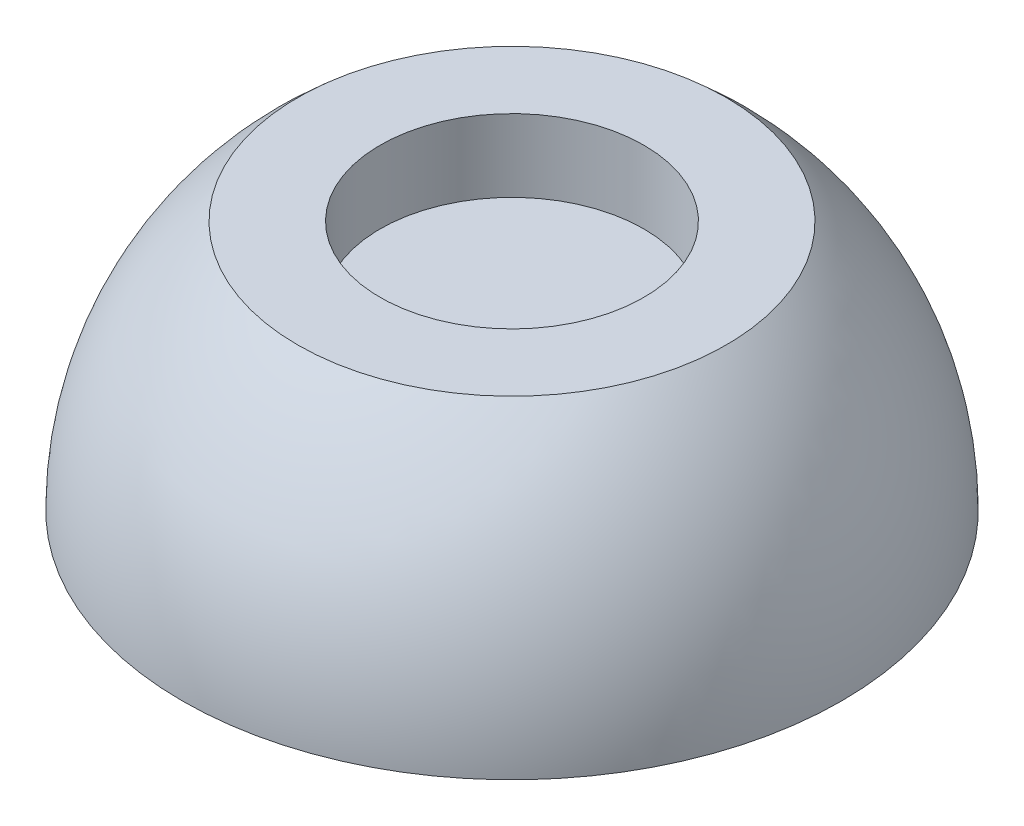
ISO-10303-21;
HEADER;
FILE_DESCRIPTION(('STEP AP214'),'2;1');
FILE_NAME('part.step','',(''),(''),'','','');
FILE_SCHEMA(('AUTOMOTIVE_DESIGN { 1 0 10303 214 1 1 1 1 }'));
ENDSEC;
DATA;
#1=APPLICATION_CONTEXT('core data for automotive mechanical design processes');
#2=APPLICATION_PROTOCOL_DEFINITION('international standard','automotive_design',2000,#1);
#3=PRODUCT_CONTEXT('',#1,'mechanical');
#4=PRODUCT('Part','Part','',(#3));
#5=PRODUCT_RELATED_PRODUCT_CATEGORY('part','',(#4));
#6=PRODUCT_DEFINITION_FORMATION('','',#4);
#7=PRODUCT_DEFINITION_CONTEXT('part definition',#1,'design');
#8=PRODUCT_DEFINITION('design','',#6,#7);
#9=PRODUCT_DEFINITION_SHAPE('','',#8);
#10=(LENGTH_UNIT() NAMED_UNIT(*) SI_UNIT(.MILLI.,.METRE.));
#11=(NAMED_UNIT(*) PLANE_ANGLE_UNIT() SI_UNIT($,.RADIAN.));
#12=(NAMED_UNIT(*) SI_UNIT($,.STERADIAN.) SOLID_ANGLE_UNIT());
#13=UNCERTAINTY_MEASURE_WITH_UNIT(LENGTH_MEASURE(1.E-05),#10,'distance_accuracy_value','');
#14=(GEOMETRIC_REPRESENTATION_CONTEXT(3) GLOBAL_UNCERTAINTY_ASSIGNED_CONTEXT((#13)) GLOBAL_UNIT_ASSIGNED_CONTEXT((#10,
#11,#12)) REPRESENTATION_CONTEXT('',''));
#15=CARTESIAN_POINT('',(0.,0.,0.));
#16=DIRECTION('',(0.,0.,1.));
#17=DIRECTION('',(1.,0.,0.));
#18=AXIS2_PLACEMENT_3D('',#15,#16,#17);
#19=CARTESIAN_POINT('',(12.5,0.,0.));
#20=DIRECTION('',(0.,-1.,0.));
#21=DIRECTION('',(0.,0.,-1.));
#22=AXIS2_PLACEMENT_3D('',#19,#20,#21);
#23=PLANE('',#22);
#24=CARTESIAN_POINT('',(0.,0.,0.));
#25=DIRECTION('',(0.,-1.,0.));
#26=DIRECTION('',(0.,0.,-1.));
#27=AXIS2_PLACEMENT_3D('',#24,#25,#26);
#28=CIRCLE('',#27,12.5);
#29=CARTESIAN_POINT('',(0.,0.,-12.5));
#30=VERTEX_POINT('',#29);
#31=EDGE_CURVE('E218',#30,#30,#28,.T.);
#32=ORIENTED_EDGE('',*,*,#31,.T.);
#33=EDGE_LOOP('',(#32));
#34=FACE_BOUND('',#33,.T.);
#35=DIRECTION('',(-0.422618261740697,0.,-0.906307787036651));
#36=VECTOR('',#35,1.);
#37=CARTESIAN_POINT('',(0.,0.,-9.));
#38=LINE('',#37,#36);
#39=CARTESIAN_POINT('',(2.55617271844715,0.,-3.51826991527231));
#40=VERTEX_POINT('',#39);
#41=CARTESIAN_POINT('',(0.,0.,-9.));
#42=VERTEX_POINT('',#41);
#43=EDGE_CURVE('E189',#40,#42,#38,.T.);
#44=ORIENTED_EDGE('',*,*,#43,.T.);
#45=DIRECTION('',(-0.422618261740697,0.,0.906307787036651));
#46=VECTOR('',#45,1.);
#47=CARTESIAN_POINT('',(-2.55617271844715,0.,-3.51826991527231));
#48=LINE('',#47,#46);
#49=CARTESIAN_POINT('',(-2.55617271844715,0.,-3.51826991527231));
#50=VERTEX_POINT('',#49);
#51=EDGE_CURVE('E59',#42,#50,#48,.T.);
#52=ORIENTED_EDGE('',*,*,#51,.T.);
#53=DIRECTION('',(-0.992546151641322,0.,0.121869343405145));
#54=VECTOR('',#53,1.);
#55=CARTESIAN_POINT('',(-8.55950864665638,0.,-2.78115294937452));
#56=LINE('',#55,#54);
#57=CARTESIAN_POINT('',(-8.55950864665638,0.,-2.78115294937452));
#58=VERTEX_POINT('',#57);
#59=EDGE_CURVE('E160',#50,#58,#56,.T.);
#60=ORIENTED_EDGE('',*,*,#59,.T.);
#61=DIRECTION('',(0.731353701619173,0.,0.681998360062496));
#62=VECTOR('',#61,1.);
#63=CARTESIAN_POINT('',(-4.13597433956271,0.,1.34385952603781));
#64=LINE('',#63,#62);
#65=CARTESIAN_POINT('',(-4.13597433956271,0.,1.34385952603781));
#66=VERTEX_POINT('',#65);
#67=EDGE_CURVE('E164',#58,#66,#64,.T.);
#68=ORIENTED_EDGE('',*,*,#67,.T.);
#69=DIRECTION('',(-0.190808995376547,0.,0.981627183447664));
#70=VECTOR('',#69,1.);
#71=CARTESIAN_POINT('',(-5.29006727063225,0.,7.28115294937453));
#72=LINE('',#71,#70);
#73=CARTESIAN_POINT('',(-5.29006727063225,0.,7.28115294937453));
#74=VERTEX_POINT('',#73);
#75=EDGE_CURVE('E168',#66,#74,#72,.T.);
#76=ORIENTED_EDGE('',*,*,#75,.T.);
#77=DIRECTION('',(0.874619707139394,0.,-0.48480962024634));
#78=VECTOR('',#77,1.);
#79=CARTESIAN_POINT('',(0.,0.,4.348820778469));
#80=LINE('',#79,#78);
#81=CARTESIAN_POINT('',(0.,0.,4.348820778469));
#82=VERTEX_POINT('',#81);
#83=EDGE_CURVE('E172',#74,#82,#80,.T.);
#84=ORIENTED_EDGE('',*,*,#83,.T.);
#85=DIRECTION('',(0.874619707139394,0.,0.48480962024634));
#86=VECTOR('',#85,1.);
#87=CARTESIAN_POINT('',(5.29006727063226,0.,7.28115294937453));
#88=LINE('',#87,#86);
#89=CARTESIAN_POINT('',(5.29006727063226,0.,7.28115294937453));
#90=VERTEX_POINT('',#89);
#91=EDGE_CURVE('E176',#82,#90,#88,.T.);
#92=ORIENTED_EDGE('',*,*,#91,.T.);
#93=DIRECTION('',(-0.190808995376547,0.,-0.981627183447664));
#94=VECTOR('',#93,1.);
#95=CARTESIAN_POINT('',(4.13597433956271,0.,1.34385952603781));
#96=LINE('',#95,#94);
#97=CARTESIAN_POINT('',(4.13597433956271,0.,1.34385952603781));
#98=VERTEX_POINT('',#97);
#99=EDGE_CURVE('E180',#90,#98,#96,.T.);
#100=ORIENTED_EDGE('',*,*,#99,.T.);
#101=DIRECTION('',(0.731353701619172,0.,-0.681998360062497));
#102=VECTOR('',#101,1.);
#103=CARTESIAN_POINT('',(8.55950864665638,0.,-2.78115294937453));
#104=LINE('',#103,#102);
#105=CARTESIAN_POINT('',(8.55950864665638,0.,-2.78115294937453));
#106=VERTEX_POINT('',#105);
#107=EDGE_CURVE('E184',#98,#106,#104,.T.);
#108=ORIENTED_EDGE('',*,*,#107,.T.);
#109=DIRECTION('',(-0.992546151641322,0.,-0.121869343405145));
#110=VECTOR('',#109,1.);
#111=CARTESIAN_POINT('',(2.55617271844715,0.,-3.51826991527231));
#112=LINE('',#111,#110);
#113=EDGE_CURVE('E146',#106,#40,#112,.T.);
#114=ORIENTED_EDGE('',*,*,#113,.T.);
#115=EDGE_LOOP('',(#44,#52,#60,#68,#76,#84,#92,#100,#108,#114));
#116=FACE_BOUND('',#115,.T.);
#117=ADVANCED_FACE('F43',(#34,#116),#23,.T.);
#118=CARTESIAN_POINT('',(0.,0.,0.));
#119=DIRECTION('',(0.,-1.,0.));
#120=DIRECTION('',(1.,0.,0.));
#121=AXIS2_PLACEMENT_3D('',#118,#119,#120);
#122=SPHERICAL_SURFACE('',#121,12.5);
#123=CARTESIAN_POINT('',(0.,9.5,0.));
#124=DIRECTION('',(0.,-1.,0.));
#125=DIRECTION('',(0.,0.,-1.));
#126=AXIS2_PLACEMENT_3D('',#123,#124,#125);
#127=CIRCLE('',#126,8.12403840463596);
#128=CARTESIAN_POINT('',(0.,9.5,-8.12403840463596));
#129=VERTEX_POINT('',#128);
#130=EDGE_CURVE('E11',#129,#129,#127,.T.);
#131=ORIENTED_EDGE('',*,*,#130,.T.);
#132=EDGE_LOOP('',(#131));
#133=FACE_BOUND('',#132,.T.);
#134=ORIENTED_EDGE('',*,*,#31,.F.);
#135=EDGE_LOOP('',(#134));
#136=FACE_BOUND('',#135,.T.);
#137=ADVANCED_FACE('F45',(#133,#136),#122,.T.);
#138=CARTESIAN_POINT('',(5.,9.5,0.));
#139=DIRECTION('',(0.,1.,0.));
#140=DIRECTION('',(0.,0.,1.));
#141=AXIS2_PLACEMENT_3D('',#138,#139,#140);
#142=PLANE('',#141);
#143=CARTESIAN_POINT('',(0.,9.5,0.));
#144=DIRECTION('',(0.,-1.,0.));
#145=DIRECTION('',(0.,0.,-1.));
#146=AXIS2_PLACEMENT_3D('',#143,#144,#145);
#147=CIRCLE('',#146,5.);
#148=CARTESIAN_POINT('',(0.,9.5,-5.));
#149=VERTEX_POINT('',#148);
#150=EDGE_CURVE('E52',#149,#149,#147,.T.);
#151=ORIENTED_EDGE('',*,*,#150,.T.);
#152=EDGE_LOOP('',(#151));
#153=FACE_BOUND('',#152,.T.);
#154=ORIENTED_EDGE('',*,*,#130,.F.);
#155=EDGE_LOOP('',(#154));
#156=FACE_BOUND('',#155,.T.);
#157=ADVANCED_FACE('F229',(#153,#156),#142,.T.);
#158=CARTESIAN_POINT('',(0.,0.,0.));
#159=DIRECTION('',(0.,-1.,0.));
#160=DIRECTION('',(0.,0.,-1.));
#161=AXIS2_PLACEMENT_3D('',#158,#159,#160);
#162=CYLINDRICAL_SURFACE('',#161,5.);
#163=CARTESIAN_POINT('',(0.,6.75,0.));
#164=DIRECTION('',(0.,-1.,0.));
#165=DIRECTION('',(0.,0.,-1.));
#166=AXIS2_PLACEMENT_3D('',#163,#164,#165);
#167=CIRCLE('',#166,5.);
#168=CARTESIAN_POINT('',(0.,6.75,-5.));
#169=VERTEX_POINT('',#168);
#170=EDGE_CURVE('E222',#169,#169,#167,.T.);
#171=ORIENTED_EDGE('',*,*,#170,.T.);
#172=EDGE_LOOP('',(#171));
#173=FACE_BOUND('',#172,.T.);
#174=ORIENTED_EDGE('',*,*,#150,.F.);
#175=EDGE_LOOP('',(#174));
#176=FACE_BOUND('',#175,.T.);
#177=ADVANCED_FACE('F232',(#173,#176),#162,.F.);
#178=CARTESIAN_POINT('',(0.,6.75,0.));
#179=DIRECTION('',(0.,1.,0.));
#180=DIRECTION('',(0.,0.,1.));
#181=AXIS2_PLACEMENT_3D('',#178,#179,#180);
#182=PLANE('',#181);
#183=ORIENTED_EDGE('',*,*,#170,.F.);
#184=EDGE_LOOP('',(#183));
#185=FACE_BOUND('',#184,.T.);
#186=ADVANCED_FACE('F234',(#185),#182,.T.);
#187=CARTESIAN_POINT('',(-2.55617271844715,5.,-3.51826991527231));
#188=DIRECTION('',(0.906307787036651,0.,0.422618261740697));
#189=DIRECTION('',(0.422618261740697,0.,-0.906307787036651));
#190=AXIS2_PLACEMENT_3D('',#187,#188,#189);
#191=PLANE('',#190);
#192=ORIENTED_EDGE('',*,*,#51,.F.);
#193=DIRECTION('',(0.,-1.,0.));
#194=VECTOR('',#193,1.);
#195=CARTESIAN_POINT('',(0.,5.,-9.));
#196=LINE('',#195,#194);
#197=CARTESIAN_POINT('',(0.,5.,-9.));
#198=VERTEX_POINT('',#197);
#199=EDGE_CURVE('E154',#198,#42,#196,.T.);
#200=ORIENTED_EDGE('',*,*,#199,.F.);
#201=DIRECTION('',(-0.422618261740697,0.,0.906307787036651));
#202=VECTOR('',#201,1.);
#203=CARTESIAN_POINT('',(-2.55617271844715,5.,-3.51826991527231));
#204=LINE('',#203,#202);
#205=CARTESIAN_POINT('',(-2.55617271844715,5.,-3.51826991527231));
#206=VERTEX_POINT('',#205);
#207=EDGE_CURVE('E193',#198,#206,#204,.T.);
#208=ORIENTED_EDGE('',*,*,#207,.T.);
#209=DIRECTION('',(0.,-1.,0.));
#210=VECTOR('',#209,1.);
#211=CARTESIAN_POINT('',(-2.55617271844715,5.,-3.51826991527231));
#212=LINE('',#211,#210);
#213=EDGE_CURVE('E215',#206,#50,#212,.T.);
#214=ORIENTED_EDGE('',*,*,#213,.T.);
#215=EDGE_LOOP('',(#192,#200,#208,#214));
#216=FACE_BOUND('',#215,.T.);
#217=ADVANCED_FACE('F241',(#216),#191,.T.);
#218=CARTESIAN_POINT('',(-8.55950864665638,5.,-2.78115294937452));
#219=DIRECTION('',(0.121869343405145,0.,0.992546151641322));
#220=DIRECTION('',(0.992546151641322,0.,-0.121869343405145));
#221=AXIS2_PLACEMENT_3D('',#218,#219,#220);
#222=PLANE('',#221);
#223=ORIENTED_EDGE('',*,*,#59,.F.);
#224=ORIENTED_EDGE('',*,*,#213,.F.);
#225=DIRECTION('',(-0.992546151641322,0.,0.121869343405145));
#226=VECTOR('',#225,1.);
#227=CARTESIAN_POINT('',(-8.55950864665638,5.,-2.78115294937452));
#228=LINE('',#227,#226);
#229=CARTESIAN_POINT('',(-8.55950864665638,5.,-2.78115294937452));
#230=VERTEX_POINT('',#229);
#231=EDGE_CURVE('E110',#206,#230,#228,.T.);
#232=ORIENTED_EDGE('',*,*,#231,.T.);
#233=DIRECTION('',(0.,-1.,0.));
#234=VECTOR('',#233,1.);
#235=CARTESIAN_POINT('',(-8.55950864665638,5.,-2.78115294937452));
#236=LINE('',#235,#234);
#237=EDGE_CURVE('E212',#230,#58,#236,.T.);
#238=ORIENTED_EDGE('',*,*,#237,.T.);
#239=EDGE_LOOP('',(#223,#224,#232,#238));
#240=FACE_BOUND('',#239,.T.);
#241=ADVANCED_FACE('F255',(#240),#222,.T.);
#242=CARTESIAN_POINT('',(-4.13597433956271,5.,1.34385952603781));
#243=DIRECTION('',(0.681998360062496,0.,-0.731353701619173));
#244=DIRECTION('',(-0.731353701619173,0.,-0.681998360062496));
#245=AXIS2_PLACEMENT_3D('',#242,#243,#244);
#246=PLANE('',#245);
#247=ORIENTED_EDGE('',*,*,#67,.F.);
#248=ORIENTED_EDGE('',*,*,#237,.F.);
#249=DIRECTION('',(0.731353701619173,0.,0.681998360062496));
#250=VECTOR('',#249,1.);
#251=CARTESIAN_POINT('',(-4.13597433956271,5.,1.34385952603781));
#252=LINE('',#251,#250);
#253=CARTESIAN_POINT('',(-4.13597433956271,5.,1.34385952603781));
#254=VERTEX_POINT('',#253);
#255=EDGE_CURVE('E426',#230,#254,#252,.T.);
#256=ORIENTED_EDGE('',*,*,#255,.T.);
#257=DIRECTION('',(0.,-1.,0.));
#258=VECTOR('',#257,1.);
#259=CARTESIAN_POINT('',(-4.13597433956271,5.,1.34385952603781));
#260=LINE('',#259,#258);
#261=EDGE_CURVE('E209',#254,#66,#260,.T.);
#262=ORIENTED_EDGE('',*,*,#261,.T.);
#263=EDGE_LOOP('',(#247,#248,#256,#262));
#264=FACE_BOUND('',#263,.T.);
#265=ADVANCED_FACE('F258',(#264),#246,.T.);
#266=CARTESIAN_POINT('',(-5.29006727063225,5.,7.28115294937453));
#267=DIRECTION('',(0.981627183447664,0.,0.190808995376547));
#268=DIRECTION('',(0.190808995376547,0.,-0.981627183447664));
#269=AXIS2_PLACEMENT_3D('',#266,#267,#268);
#270=PLANE('',#269);
#271=ORIENTED_EDGE('',*,*,#75,.F.);
#272=ORIENTED_EDGE('',*,*,#261,.F.);
#273=DIRECTION('',(-0.190808995376547,0.,0.981627183447664));
#274=VECTOR('',#273,1.);
#275=CARTESIAN_POINT('',(-5.29006727063225,5.,7.28115294937453));
#276=LINE('',#275,#274);
#277=CARTESIAN_POINT('',(-5.29006727063225,5.,7.28115294937453));
#278=VERTEX_POINT('',#277);
#279=EDGE_CURVE('E423',#254,#278,#276,.T.);
#280=ORIENTED_EDGE('',*,*,#279,.T.);
#281=DIRECTION('',(0.,-1.,0.));
#282=VECTOR('',#281,1.);
#283=CARTESIAN_POINT('',(-5.29006727063225,5.,7.28115294937453));
#284=LINE('',#283,#282);
#285=EDGE_CURVE('E206',#278,#74,#284,.T.);
#286=ORIENTED_EDGE('',*,*,#285,.T.);
#287=EDGE_LOOP('',(#271,#272,#280,#286));
#288=FACE_BOUND('',#287,.T.);
#289=ADVANCED_FACE('F262',(#288),#270,.T.);
#290=CARTESIAN_POINT('',(0.,5.,4.348820778469));
#291=DIRECTION('',(-0.48480962024634,0.,-0.874619707139394));
#292=DIRECTION('',(-0.874619707139394,0.,0.48480962024634));
#293=AXIS2_PLACEMENT_3D('',#290,#291,#292);
#294=PLANE('',#293);
#295=ORIENTED_EDGE('',*,*,#83,.F.);
#296=ORIENTED_EDGE('',*,*,#285,.F.);
#297=DIRECTION('',(0.874619707139394,0.,-0.48480962024634));
#298=VECTOR('',#297,1.);
#299=CARTESIAN_POINT('',(0.,5.,4.348820778469));
#300=LINE('',#299,#298);
#301=CARTESIAN_POINT('',(0.,5.,4.348820778469));
#302=VERTEX_POINT('',#301);
#303=EDGE_CURVE('E418',#278,#302,#300,.T.);
#304=ORIENTED_EDGE('',*,*,#303,.T.);
#305=DIRECTION('',(0.,-1.,0.));
#306=VECTOR('',#305,1.);
#307=CARTESIAN_POINT('',(0.,5.,4.348820778469));
#308=LINE('',#307,#306);
#309=EDGE_CURVE('E203',#302,#82,#308,.T.);
#310=ORIENTED_EDGE('',*,*,#309,.T.);
#311=EDGE_LOOP('',(#295,#296,#304,#310));
#312=FACE_BOUND('',#311,.T.);
#313=ADVANCED_FACE('F266',(#312),#294,.T.);
#314=CARTESIAN_POINT('',(5.29006727063226,5.,7.28115294937453));
#315=DIRECTION('',(0.48480962024634,0.,-0.874619707139394));
#316=DIRECTION('',(-0.874619707139394,0.,-0.48480962024634));
#317=AXIS2_PLACEMENT_3D('',#314,#315,#316);
#318=PLANE('',#317);
#319=ORIENTED_EDGE('',*,*,#91,.F.);
#320=ORIENTED_EDGE('',*,*,#309,.F.);
#321=DIRECTION('',(0.874619707139394,0.,0.48480962024634));
#322=VECTOR('',#321,1.);
#323=CARTESIAN_POINT('',(5.29006727063226,5.,7.28115294937453));
#324=LINE('',#323,#322);
#325=CARTESIAN_POINT('',(5.29006727063226,5.,7.28115294937453));
#326=VERTEX_POINT('',#325);
#327=EDGE_CURVE('E416',#302,#326,#324,.T.);
#328=ORIENTED_EDGE('',*,*,#327,.T.);
#329=DIRECTION('',(0.,-1.,0.));
#330=VECTOR('',#329,1.);
#331=CARTESIAN_POINT('',(5.29006727063226,5.,7.28115294937453));
#332=LINE('',#331,#330);
#333=EDGE_CURVE('E200',#326,#90,#332,.T.);
#334=ORIENTED_EDGE('',*,*,#333,.T.);
#335=EDGE_LOOP('',(#319,#320,#328,#334));
#336=FACE_BOUND('',#335,.T.);
#337=ADVANCED_FACE('F270',(#336),#318,.T.);
#338=CARTESIAN_POINT('',(4.13597433956271,5.,1.34385952603781));
#339=DIRECTION('',(-0.981627183447664,0.,0.190808995376547));
#340=DIRECTION('',(0.190808995376547,0.,0.981627183447664));
#341=AXIS2_PLACEMENT_3D('',#338,#339,#340);
#342=PLANE('',#341);
#343=ORIENTED_EDGE('',*,*,#99,.F.);
#344=ORIENTED_EDGE('',*,*,#333,.F.);
#345=DIRECTION('',(-0.190808995376547,0.,-0.981627183447664));
#346=VECTOR('',#345,1.);
#347=CARTESIAN_POINT('',(4.13597433956271,5.,1.34385952603781));
#348=LINE('',#347,#346);
#349=CARTESIAN_POINT('',(4.13597433956271,5.,1.34385952603781));
#350=VERTEX_POINT('',#349);
#351=EDGE_CURVE('E142',#326,#350,#348,.T.);
#352=ORIENTED_EDGE('',*,*,#351,.T.);
#353=DIRECTION('',(0.,-1.,0.));
#354=VECTOR('',#353,1.);
#355=CARTESIAN_POINT('',(4.13597433956271,5.,1.34385952603781));
#356=LINE('',#355,#354);
#357=EDGE_CURVE('E137',#350,#98,#356,.T.);
#358=ORIENTED_EDGE('',*,*,#357,.T.);
#359=EDGE_LOOP('',(#343,#344,#352,#358));
#360=FACE_BOUND('',#359,.T.);
#361=ADVANCED_FACE('F274',(#360),#342,.T.);
#362=CARTESIAN_POINT('',(8.55950864665638,5.,-2.78115294937453));
#363=DIRECTION('',(-0.681998360062497,0.,-0.731353701619172));
#364=DIRECTION('',(-0.731353701619172,0.,0.681998360062497));
#365=AXIS2_PLACEMENT_3D('',#362,#363,#364);
#366=PLANE('',#365);
#367=ORIENTED_EDGE('',*,*,#107,.F.);
#368=ORIENTED_EDGE('',*,*,#357,.F.);
#369=DIRECTION('',(0.731353701619172,0.,-0.681998360062497));
#370=VECTOR('',#369,1.);
#371=CARTESIAN_POINT('',(8.55950864665638,5.,-2.78115294937453));
#372=LINE('',#371,#370);
#373=CARTESIAN_POINT('',(8.55950864665638,5.,-2.78115294937453));
#374=VERTEX_POINT('',#373);
#375=EDGE_CURVE('E132',#350,#374,#372,.T.);
#376=ORIENTED_EDGE('',*,*,#375,.T.);
#377=DIRECTION('',(0.,-1.,0.));
#378=VECTOR('',#377,1.);
#379=CARTESIAN_POINT('',(8.55950864665638,5.,-2.78115294937453));
#380=LINE('',#379,#378);
#381=EDGE_CURVE('E136',#374,#106,#380,.T.);
#382=ORIENTED_EDGE('',*,*,#381,.T.);
#383=EDGE_LOOP('',(#367,#368,#376,#382));
#384=FACE_BOUND('',#383,.T.);
#385=ADVANCED_FACE('F135',(#384),#366,.T.);
#386=CARTESIAN_POINT('',(2.55617271844715,5.,-3.51826991527231));
#387=DIRECTION('',(-0.121869343405145,0.,0.992546151641322));
#388=DIRECTION('',(0.992546151641322,0.,0.121869343405145));
#389=AXIS2_PLACEMENT_3D('',#386,#387,#388);
#390=PLANE('',#389);
#391=ORIENTED_EDGE('',*,*,#113,.F.);
#392=ORIENTED_EDGE('',*,*,#381,.F.);
#393=DIRECTION('',(-0.992546151641322,0.,-0.121869343405145));
#394=VECTOR('',#393,1.);
#395=CARTESIAN_POINT('',(2.55617271844715,5.,-3.51826991527231));
#396=LINE('',#395,#394);
#397=CARTESIAN_POINT('',(2.55617271844715,5.,-3.51826991527231));
#398=VERTEX_POINT('',#397);
#399=EDGE_CURVE('E141',#374,#398,#396,.T.);
#400=ORIENTED_EDGE('',*,*,#399,.T.);
#401=DIRECTION('',(0.,-1.,0.));
#402=VECTOR('',#401,1.);
#403=CARTESIAN_POINT('',(2.55617271844715,5.,-3.51826991527231));
#404=LINE('',#403,#402);
#405=EDGE_CURVE('E101',#398,#40,#404,.T.);
#406=ORIENTED_EDGE('',*,*,#405,.T.);
#407=EDGE_LOOP('',(#391,#392,#400,#406));
#408=FACE_BOUND('',#407,.T.);
#409=ADVANCED_FACE('F144',(#408),#390,.T.);
#410=CARTESIAN_POINT('',(0.,5.,-9.));
#411=DIRECTION('',(-0.906307787036651,0.,0.422618261740697));
#412=DIRECTION('',(0.422618261740697,0.,0.906307787036651));
#413=AXIS2_PLACEMENT_3D('',#410,#411,#412);
#414=PLANE('',#413);
#415=ORIENTED_EDGE('',*,*,#43,.F.);
#416=ORIENTED_EDGE('',*,*,#405,.F.);
#417=DIRECTION('',(-0.422618261740697,0.,-0.906307787036651));
#418=VECTOR('',#417,1.);
#419=CARTESIAN_POINT('',(0.,5.,-9.));
#420=LINE('',#419,#418);
#421=EDGE_CURVE('E67',#398,#198,#420,.T.);
#422=ORIENTED_EDGE('',*,*,#421,.T.);
#423=ORIENTED_EDGE('',*,*,#199,.T.);
#424=EDGE_LOOP('',(#415,#416,#422,#423));
#425=FACE_BOUND('',#424,.T.);
#426=ADVANCED_FACE('F283',(#425),#414,.T.);
#427=CARTESIAN_POINT('',(0.,5.,0.));
#428=DIRECTION('',(0.,1.,0.));
#429=DIRECTION('',(0.,0.,1.));
#430=AXIS2_PLACEMENT_3D('',#427,#428,#429);
#431=PLANE('',#430);
#432=ORIENTED_EDGE('',*,*,#207,.F.);
#433=ORIENTED_EDGE('',*,*,#421,.F.);
#434=ORIENTED_EDGE('',*,*,#399,.F.);
#435=ORIENTED_EDGE('',*,*,#375,.F.);
#436=ORIENTED_EDGE('',*,*,#351,.F.);
#437=ORIENTED_EDGE('',*,*,#327,.F.);
#438=ORIENTED_EDGE('',*,*,#303,.F.);
#439=ORIENTED_EDGE('',*,*,#279,.F.);
#440=ORIENTED_EDGE('',*,*,#255,.F.);
#441=ORIENTED_EDGE('',*,*,#231,.F.);
#442=EDGE_LOOP('',(#432,#433,#434,#435,#436,#437,#438,#439,#440,#441));
#443=FACE_BOUND('',#442,.T.);
#444=ADVANCED_FACE('F150',(#443),#431,.F.);
#445=CLOSED_SHELL('',(#117,#137,#157,#177,#186,#217,#241,#265,#289,#313,#337,#361,#385,#409,
#426,#444));
#446=MANIFOLD_SOLID_BREP('B2',#445);
#447=ADVANCED_BREP_SHAPE_REPRESENTATION('',(#18,#446),#14);
#448=SHAPE_DEFINITION_REPRESENTATION(#9,#447);
ENDSEC;
END-ISO-10303-21;
